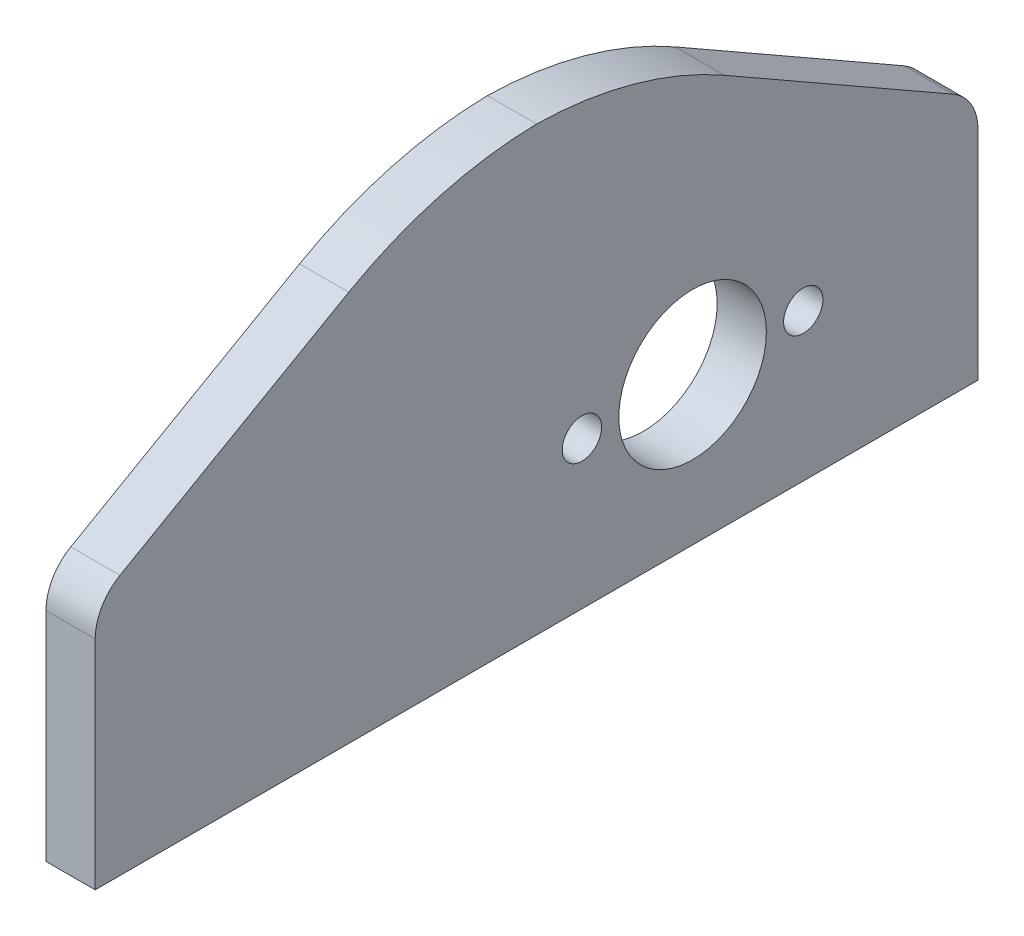
ISO-10303-21;
HEADER;
FILE_DESCRIPTION(('STEP AP214'),'2;1');
FILE_NAME('part.step','',(''),(''),'','','');
FILE_SCHEMA(('AUTOMOTIVE_DESIGN { 1 0 10303 214 1 1 1 1 }'));
ENDSEC;
DATA;
#1=APPLICATION_CONTEXT('core data for automotive mechanical design processes');
#2=APPLICATION_PROTOCOL_DEFINITION('international standard','automotive_design',2000,#1);
#3=PRODUCT_CONTEXT('',#1,'mechanical');
#4=PRODUCT('Part','Part','',(#3));
#5=PRODUCT_RELATED_PRODUCT_CATEGORY('part','',(#4));
#6=PRODUCT_DEFINITION_FORMATION('','',#4);
#7=PRODUCT_DEFINITION_CONTEXT('part definition',#1,'design');
#8=PRODUCT_DEFINITION('design','',#6,#7);
#9=PRODUCT_DEFINITION_SHAPE('','',#8);
#10=(LENGTH_UNIT() NAMED_UNIT(*) SI_UNIT(.MILLI.,.METRE.));
#11=(NAMED_UNIT(*) PLANE_ANGLE_UNIT() SI_UNIT($,.RADIAN.));
#12=(NAMED_UNIT(*) SI_UNIT($,.STERADIAN.) SOLID_ANGLE_UNIT());
#13=UNCERTAINTY_MEASURE_WITH_UNIT(LENGTH_MEASURE(1.E-05),#10,'distance_accuracy_value','');
#14=(GEOMETRIC_REPRESENTATION_CONTEXT(3) GLOBAL_UNCERTAINTY_ASSIGNED_CONTEXT((#13)) GLOBAL_UNIT_ASSIGNED_CONTEXT((#10,
#11,#12)) REPRESENTATION_CONTEXT('',''));
#15=CARTESIAN_POINT('',(0.,0.,0.));
#16=DIRECTION('',(0.,0.,1.));
#17=DIRECTION('',(1.,0.,0.));
#18=AXIS2_PLACEMENT_3D('',#15,#16,#17);
#19=CARTESIAN_POINT('',(2.,0.,-17.95));
#20=DIRECTION('',(0.,0.,1.));
#21=DIRECTION('',(1.,0.,0.));
#22=AXIS2_PLACEMENT_3D('',#19,#20,#21);
#23=PLANE('',#22);
#24=DIRECTION('',(0.,1.,0.));
#25=VECTOR('',#24,1.);
#26=CARTESIAN_POINT('',(0.,0.,-17.95));
#27=LINE('',#26,#25);
#28=CARTESIAN_POINT('',(0.,-10.,-17.95));
#29=VERTEX_POINT('',#28);
#30=CARTESIAN_POINT('',(0.,-1.16064507094244,-17.95));
#31=VERTEX_POINT('',#30);
#32=EDGE_CURVE('E141',#29,#31,#27,.T.);
#33=ORIENTED_EDGE('',*,*,#32,.T.);
#34=DIRECTION('',(-1.,0.,0.));
#35=VECTOR('',#34,1.);
#36=CARTESIAN_POINT('',(2.,-1.16064507094244,-17.95));
#37=LINE('',#36,#35);
#38=CARTESIAN_POINT('',(2.,-1.16064507094244,-17.95));
#39=VERTEX_POINT('',#38);
#40=EDGE_CURVE('E169',#31,#39,#37,.F.);
#41=ORIENTED_EDGE('',*,*,#40,.T.);
#42=DIRECTION('',(0.,1.,0.));
#43=VECTOR('',#42,1.);
#44=CARTESIAN_POINT('',(2.,0.,-17.95));
#45=LINE('',#44,#43);
#46=CARTESIAN_POINT('',(2.,-10.,-17.95));
#47=VERTEX_POINT('',#46);
#48=EDGE_CURVE('E157',#47,#39,#45,.T.);
#49=ORIENTED_EDGE('',*,*,#48,.F.);
#50=DIRECTION('',(-1.,0.,0.));
#51=VECTOR('',#50,1.);
#52=CARTESIAN_POINT('',(2.,-10.,-17.95));
#53=LINE('',#52,#51);
#54=EDGE_CURVE('E130',#47,#29,#53,.T.);
#55=ORIENTED_EDGE('',*,*,#54,.T.);
#56=EDGE_LOOP('',(#33,#41,#49,#55));
#57=FACE_BOUND('',#56,.T.);
#58=ADVANCED_FACE('F39',(#57),#23,.F.);
#59=CARTESIAN_POINT('',(2.,8.,-3.95000000000001));
#60=DIRECTION('',(0.,-0.868243142124459,0.496138938356834));
#61=DIRECTION('',(0.,-0.496138938356834,-0.868243142124459));
#62=AXIS2_PLACEMENT_3D('',#59,#60,#61);
#63=PLANE('',#62);
#64=DIRECTION('',(0.,0.496138938356834,0.868243142124459));
#65=VECTOR('',#64,1.);
#66=CARTESIAN_POINT('',(0.,8.,-3.95000000000001));
#67=LINE('',#66,#65);
#68=CARTESIAN_POINT('',(0.,0.575841213306475,-16.9422778767137));
#69=VERTEX_POINT('',#68);
#70=CARTESIAN_POINT('',(0.,5.89189027399135,-7.63919202051514));
#71=VERTEX_POINT('',#70);
#72=EDGE_CURVE('E145',#69,#71,#67,.T.);
#73=ORIENTED_EDGE('',*,*,#72,.T.);
#74=DIRECTION('',(-1.,0.,0.));
#75=VECTOR('',#74,1.);
#76=CARTESIAN_POINT('',(2.,5.89189027399135,-7.63919202051514));
#77=LINE('',#76,#75);
#78=CARTESIAN_POINT('',(2.,5.89189027399135,-7.63919202051514));
#79=VERTEX_POINT('',#78);
#80=EDGE_CURVE('E190',#71,#79,#77,.F.);
#81=ORIENTED_EDGE('',*,*,#80,.T.);
#82=DIRECTION('',(0.,0.496138938356834,0.868243142124459));
#83=VECTOR('',#82,1.);
#84=CARTESIAN_POINT('',(2.,8.,-3.95000000000001));
#85=LINE('',#84,#83);
#86=CARTESIAN_POINT('',(2.,0.575841213306475,-16.9422778767137));
#87=VERTEX_POINT('',#86);
#88=EDGE_CURVE('E201',#87,#79,#85,.T.);
#89=ORIENTED_EDGE('',*,*,#88,.F.);
#90=DIRECTION('',(-1.,0.,0.));
#91=VECTOR('',#90,1.);
#92=CARTESIAN_POINT('',(2.,0.575841213306475,-16.9422778767137));
#93=LINE('',#92,#91);
#94=EDGE_CURVE('E129',#87,#69,#93,.T.);
#95=ORIENTED_EDGE('',*,*,#94,.T.);
#96=EDGE_LOOP('',(#73,#81,#89,#95));
#97=FACE_BOUND('',#96,.T.);
#98=ADVANCED_FACE('F200',(#97),#63,.F.);
#99=CARTESIAN_POINT('',(2.,0.,17.95));
#100=DIRECTION('',(0.,-0.868243142124459,-0.496138938356834));
#101=DIRECTION('',(0.,0.496138938356834,-0.868243142124459));
#102=AXIS2_PLACEMENT_3D('',#99,#100,#101);
#103=PLANE('',#102);
#104=DIRECTION('',(0.,-0.496138938356834,0.868243142124459));
#105=VECTOR('',#104,1.);
#106=CARTESIAN_POINT('',(2.,0.,17.95));
#107=LINE('',#106,#105);
#108=CARTESIAN_POINT('',(2.,5.89189027399134,7.63919202051515));
#109=VERTEX_POINT('',#108);
#110=CARTESIAN_POINT('',(2.,0.575841213306475,16.9422778767137));
#111=VERTEX_POINT('',#110);
#112=EDGE_CURVE('E119',#109,#111,#107,.T.);
#113=ORIENTED_EDGE('',*,*,#112,.F.);
#114=DIRECTION('',(-1.,0.,0.));
#115=VECTOR('',#114,1.);
#116=CARTESIAN_POINT('',(2.,5.89189027399134,7.63919202051515));
#117=LINE('',#116,#115);
#118=CARTESIAN_POINT('',(0.,5.89189027399134,7.63919202051515));
#119=VERTEX_POINT('',#118);
#120=EDGE_CURVE('E11',#109,#119,#117,.T.);
#121=ORIENTED_EDGE('',*,*,#120,.T.);
#122=DIRECTION('',(0.,-0.496138938356834,0.868243142124459));
#123=VECTOR('',#122,1.);
#124=CARTESIAN_POINT('',(0.,0.,17.95));
#125=LINE('',#124,#123);
#126=CARTESIAN_POINT('',(0.,0.575841213306475,16.9422778767137));
#127=VERTEX_POINT('',#126);
#128=EDGE_CURVE('E150',#119,#127,#125,.T.);
#129=ORIENTED_EDGE('',*,*,#128,.T.);
#130=DIRECTION('',(-1.,0.,0.));
#131=VECTOR('',#130,1.);
#132=CARTESIAN_POINT('',(2.,0.575841213306475,16.9422778767137));
#133=LINE('',#132,#131);
#134=EDGE_CURVE('E180',#127,#111,#133,.F.);
#135=ORIENTED_EDGE('',*,*,#134,.T.);
#136=EDGE_LOOP('',(#113,#121,#129,#135));
#137=FACE_BOUND('',#136,.T.);
#138=ADVANCED_FACE('F270',(#137),#103,.F.);
#139=CARTESIAN_POINT('',(2.,0.,17.95));
#140=DIRECTION('',(0.,0.,-1.));
#141=DIRECTION('',(-1.,0.,0.));
#142=AXIS2_PLACEMENT_3D('',#139,#140,#141);
#143=PLANE('',#142);
#144=DIRECTION('',(0.,-1.,0.));
#145=VECTOR('',#144,1.);
#146=CARTESIAN_POINT('',(2.,0.,17.95));
#147=LINE('',#146,#145);
#148=CARTESIAN_POINT('',(2.,-1.16064507094244,17.95));
#149=VERTEX_POINT('',#148);
#150=CARTESIAN_POINT('',(2.,-10.,17.95));
#151=VERTEX_POINT('',#150);
#152=EDGE_CURVE('E106',#149,#151,#147,.T.);
#153=ORIENTED_EDGE('',*,*,#152,.F.);
#154=DIRECTION('',(-1.,0.,0.));
#155=VECTOR('',#154,1.);
#156=CARTESIAN_POINT('',(2.,-1.16064507094244,17.95));
#157=LINE('',#156,#155);
#158=CARTESIAN_POINT('',(0.,-1.16064507094244,17.95));
#159=VERTEX_POINT('',#158);
#160=EDGE_CURVE('E177',#149,#159,#157,.T.);
#161=ORIENTED_EDGE('',*,*,#160,.T.);
#162=DIRECTION('',(0.,-1.,0.));
#163=VECTOR('',#162,1.);
#164=CARTESIAN_POINT('',(0.,0.,17.95));
#165=LINE('',#164,#163);
#166=CARTESIAN_POINT('',(0.,-10.,17.95));
#167=VERTEX_POINT('',#166);
#168=EDGE_CURVE('E125',#159,#167,#165,.T.);
#169=ORIENTED_EDGE('',*,*,#168,.T.);
#170=DIRECTION('',(-1.,0.,0.));
#171=VECTOR('',#170,1.);
#172=CARTESIAN_POINT('',(2.,-10.,17.95));
#173=LINE('',#172,#171);
#174=EDGE_CURVE('E122',#151,#167,#173,.T.);
#175=ORIENTED_EDGE('',*,*,#174,.F.);
#176=EDGE_LOOP('',(#153,#161,#169,#175));
#177=FACE_BOUND('',#176,.T.);
#178=ADVANCED_FACE('F123',(#177),#143,.F.);
#179=CARTESIAN_POINT('',(2.,-10.,17.95));
#180=DIRECTION('',(0.,1.,0.));
#181=DIRECTION('',(0.,0.,1.));
#182=AXIS2_PLACEMENT_3D('',#179,#180,#181);
#183=PLANE('',#182);
#184=DIRECTION('',(0.,0.,-1.));
#185=VECTOR('',#184,1.);
#186=CARTESIAN_POINT('',(0.,-10.,17.95));
#187=LINE('',#186,#185);
#188=EDGE_CURVE('E155',#167,#29,#187,.T.);
#189=ORIENTED_EDGE('',*,*,#188,.T.);
#190=ORIENTED_EDGE('',*,*,#54,.F.);
#191=DIRECTION('',(0.,0.,-1.));
#192=VECTOR('',#191,1.);
#193=CARTESIAN_POINT('',(2.,-10.,17.95));
#194=LINE('',#193,#192);
#195=EDGE_CURVE('E111',#151,#47,#194,.T.);
#196=ORIENTED_EDGE('',*,*,#195,.F.);
#197=ORIENTED_EDGE('',*,*,#174,.T.);
#198=EDGE_LOOP('',(#189,#190,#196,#197));
#199=FACE_BOUND('',#198,.T.);
#200=ADVANCED_FACE('F132',(#199),#183,.F.);
#201=CARTESIAN_POINT('',(2.,0.,0.));
#202=DIRECTION('',(1.,0.,0.));
#203=DIRECTION('',(0.,0.,-1.));
#204=AXIS2_PLACEMENT_3D('',#201,#202,#203);
#205=PLANE('',#204);
#206=CARTESIAN_POINT('',(2.,-4.,-10.8442887702248));
#207=DIRECTION('',(1.,0.,0.));
#208=DIRECTION('',(0.,0.,-1.));
#209=AXIS2_PLACEMENT_3D('',#206,#207,#208);
#210=CIRCLE('',#209,0.800000000000001);
#211=CARTESIAN_POINT('',(2.,-4.,-11.6442887702248));
#212=VERTEX_POINT('',#211);
#213=EDGE_CURVE('E221',#212,#212,#210,.T.);
#214=ORIENTED_EDGE('',*,*,#213,.F.);
#215=EDGE_LOOP('',(#214));
#216=FACE_BOUND('',#215,.T.);
#217=CARTESIAN_POINT('',(2.,-4.,-1.84428877022476));
#218=DIRECTION('',(1.,0.,0.));
#219=DIRECTION('',(0.,0.,-1.));
#220=AXIS2_PLACEMENT_3D('',#217,#218,#219);
#221=CIRCLE('',#220,0.8);
#222=CARTESIAN_POINT('',(2.,-4.,-2.64428877022476));
#223=VERTEX_POINT('',#222);
#224=EDGE_CURVE('E229',#223,#223,#221,.T.);
#225=ORIENTED_EDGE('',*,*,#224,.F.);
#226=EDGE_LOOP('',(#225));
#227=FACE_BOUND('',#226,.T.);
#228=CARTESIAN_POINT('',(2.,-4.,-6.34428877022476));
#229=DIRECTION('',(1.,0.,0.));
#230=DIRECTION('',(0.,0.,-1.));
#231=AXIS2_PLACEMENT_3D('',#228,#229,#230);
#232=CIRCLE('',#231,3.);
#233=CARTESIAN_POINT('',(2.,-4.,-9.34428877022476));
#234=VERTEX_POINT('',#233);
#235=EDGE_CURVE('E213',#234,#234,#232,.T.);
#236=ORIENTED_EDGE('',*,*,#235,.F.);
#237=EDGE_LOOP('',(#236));
#238=FACE_BOUND('',#237,.T.);
#239=ORIENTED_EDGE('',*,*,#88,.T.);
#240=CARTESIAN_POINT('',(2.,-8.,0.299030993194197));
#241=DIRECTION('',(1.,0.,0.));
#242=DIRECTION('',(0.,0.,-1.));
#243=AXIS2_PLACEMENT_3D('',#240,#241,#242);
#244=CIRCLE('',#243,16.);
#245=CARTESIAN_POINT('',(2.,7.99720539547796,0.));
#246=VERTEX_POINT('',#245);
#247=EDGE_CURVE('E49',#79,#246,#244,.T.);
#248=ORIENTED_EDGE('',*,*,#247,.T.);
#249=CARTESIAN_POINT('',(2.,-8.,-0.299030993194194));
#250=DIRECTION('',(1.,0.,0.));
#251=DIRECTION('',(0.,0.,-1.));
#252=AXIS2_PLACEMENT_3D('',#249,#250,#251);
#253=CIRCLE('',#252,16.);
#254=EDGE_CURVE('E59',#246,#109,#253,.T.);
#255=ORIENTED_EDGE('',*,*,#254,.T.);
#256=ORIENTED_EDGE('',*,*,#112,.T.);
#257=CARTESIAN_POINT('',(2.,-1.16064507094244,15.95));
#258=DIRECTION('',(1.,0.,0.));
#259=DIRECTION('',(0.,0.,-1.));
#260=AXIS2_PLACEMENT_3D('',#257,#258,#259);
#261=CIRCLE('',#260,2.);
#262=EDGE_CURVE('E114',#111,#149,#261,.T.);
#263=ORIENTED_EDGE('',*,*,#262,.T.);
#264=ORIENTED_EDGE('',*,*,#152,.T.);
#265=ORIENTED_EDGE('',*,*,#195,.T.);
#266=ORIENTED_EDGE('',*,*,#48,.T.);
#267=CARTESIAN_POINT('',(2.,-1.16064507094244,-15.95));
#268=DIRECTION('',(1.,0.,0.));
#269=DIRECTION('',(0.,0.,-1.));
#270=AXIS2_PLACEMENT_3D('',#267,#268,#269);
#271=CIRCLE('',#270,2.);
#272=EDGE_CURVE('E174',#39,#87,#271,.T.);
#273=ORIENTED_EDGE('',*,*,#272,.T.);
#274=EDGE_LOOP('',(#239,#248,#255,#256,#263,#264,#265,#266,#273));
#275=FACE_BOUND('',#274,.T.);
#276=ADVANCED_FACE('F108',(#216,#227,#238,#275),#205,.T.);
#277=CARTESIAN_POINT('',(0.,0.,0.));
#278=DIRECTION('',(1.,0.,0.));
#279=DIRECTION('',(0.,0.,-1.));
#280=AXIS2_PLACEMENT_3D('',#277,#278,#279);
#281=PLANE('',#280);
#282=CARTESIAN_POINT('',(0.,-4.,-10.8442887702248));
#283=DIRECTION('',(1.,0.,0.));
#284=DIRECTION('',(0.,0.,-1.));
#285=AXIS2_PLACEMENT_3D('',#282,#283,#284);
#286=CIRCLE('',#285,0.800000000000001);
#287=CARTESIAN_POINT('',(0.,-4.,-11.6442887702248));
#288=VERTEX_POINT('',#287);
#289=EDGE_CURVE('E225',#288,#288,#286,.T.);
#290=ORIENTED_EDGE('',*,*,#289,.T.);
#291=EDGE_LOOP('',(#290));
#292=FACE_BOUND('',#291,.T.);
#293=CARTESIAN_POINT('',(0.,-4.,-1.84428877022476));
#294=DIRECTION('',(1.,0.,0.));
#295=DIRECTION('',(0.,0.,-1.));
#296=AXIS2_PLACEMENT_3D('',#293,#294,#295);
#297=CIRCLE('',#296,0.8);
#298=CARTESIAN_POINT('',(0.,-4.,-2.64428877022476));
#299=VERTEX_POINT('',#298);
#300=EDGE_CURVE('E217',#299,#299,#297,.T.);
#301=ORIENTED_EDGE('',*,*,#300,.T.);
#302=EDGE_LOOP('',(#301));
#303=FACE_BOUND('',#302,.T.);
#304=CARTESIAN_POINT('',(0.,-4.,-6.34428877022476));
#305=DIRECTION('',(1.,0.,0.));
#306=DIRECTION('',(0.,0.,-1.));
#307=AXIS2_PLACEMENT_3D('',#304,#305,#306);
#308=CIRCLE('',#307,3.);
#309=CARTESIAN_POINT('',(0.,-4.,-9.34428877022476));
#310=VERTEX_POINT('',#309);
#311=EDGE_CURVE('E146',#310,#310,#308,.T.);
#312=ORIENTED_EDGE('',*,*,#311,.T.);
#313=EDGE_LOOP('',(#312));
#314=FACE_BOUND('',#313,.T.);
#315=CARTESIAN_POINT('',(0.,-8.,-0.299030993194194));
#316=DIRECTION('',(1.,0.,0.));
#317=DIRECTION('',(0.,0.,-1.));
#318=AXIS2_PLACEMENT_3D('',#315,#316,#317);
#319=CIRCLE('',#318,16.);
#320=CARTESIAN_POINT('',(0.,7.99720539547796,0.));
#321=VERTEX_POINT('',#320);
#322=EDGE_CURVE('E184',#119,#321,#319,.F.);
#323=ORIENTED_EDGE('',*,*,#322,.T.);
#324=CARTESIAN_POINT('',(0.,-8.,0.299030993194197));
#325=DIRECTION('',(1.,0.,0.));
#326=DIRECTION('',(0.,0.,-1.));
#327=AXIS2_PLACEMENT_3D('',#324,#325,#326);
#328=CIRCLE('',#327,16.);
#329=EDGE_CURVE('E187',#321,#71,#328,.F.);
#330=ORIENTED_EDGE('',*,*,#329,.T.);
#331=ORIENTED_EDGE('',*,*,#72,.F.);
#332=CARTESIAN_POINT('',(0.,-1.16064507094244,-15.95));
#333=DIRECTION('',(1.,0.,0.));
#334=DIRECTION('',(0.,0.,-1.));
#335=AXIS2_PLACEMENT_3D('',#332,#333,#334);
#336=CIRCLE('',#335,2.);
#337=EDGE_CURVE('E166',#69,#31,#336,.F.);
#338=ORIENTED_EDGE('',*,*,#337,.T.);
#339=ORIENTED_EDGE('',*,*,#32,.F.);
#340=ORIENTED_EDGE('',*,*,#188,.F.);
#341=ORIENTED_EDGE('',*,*,#168,.F.);
#342=CARTESIAN_POINT('',(0.,-1.16064507094244,15.95));
#343=DIRECTION('',(1.,0.,0.));
#344=DIRECTION('',(0.,0.,-1.));
#345=AXIS2_PLACEMENT_3D('',#342,#343,#344);
#346=CIRCLE('',#345,2.);
#347=EDGE_CURVE('E162',#159,#127,#346,.F.);
#348=ORIENTED_EDGE('',*,*,#347,.T.);
#349=ORIENTED_EDGE('',*,*,#128,.F.);
#350=EDGE_LOOP('',(#323,#330,#331,#338,#339,#340,#341,#348,#349));
#351=FACE_BOUND('',#350,.T.);
#352=ADVANCED_FACE('F237',(#292,#303,#314,#351),#281,.F.);
#353=CARTESIAN_POINT('',(0.,-4.,-6.34428877022476));
#354=DIRECTION('',(1.,0.,0.));
#355=DIRECTION('',(0.,0.,-1.));
#356=AXIS2_PLACEMENT_3D('',#353,#354,#355);
#357=CYLINDRICAL_SURFACE('',#356,3.);
#358=ORIENTED_EDGE('',*,*,#311,.F.);
#359=EDGE_LOOP('',(#358));
#360=FACE_BOUND('',#359,.T.);
#361=ORIENTED_EDGE('',*,*,#235,.T.);
#362=EDGE_LOOP('',(#361));
#363=FACE_BOUND('',#362,.T.);
#364=ADVANCED_FACE('F244',(#360,#363),#357,.F.);
#365=CARTESIAN_POINT('',(0.,-4.,-1.84428877022476));
#366=DIRECTION('',(1.,0.,0.));
#367=DIRECTION('',(0.,0.,-1.));
#368=AXIS2_PLACEMENT_3D('',#365,#366,#367);
#369=CYLINDRICAL_SURFACE('',#368,0.8);
#370=ORIENTED_EDGE('',*,*,#300,.F.);
#371=EDGE_LOOP('',(#370));
#372=FACE_BOUND('',#371,.T.);
#373=ORIENTED_EDGE('',*,*,#224,.T.);
#374=EDGE_LOOP('',(#373));
#375=FACE_BOUND('',#374,.T.);
#376=ADVANCED_FACE('F240',(#372,#375),#369,.F.);
#377=CARTESIAN_POINT('',(0.,-4.,-10.8442887702248));
#378=DIRECTION('',(1.,0.,0.));
#379=DIRECTION('',(0.,0.,-1.));
#380=AXIS2_PLACEMENT_3D('',#377,#378,#379);
#381=CYLINDRICAL_SURFACE('',#380,0.800000000000001);
#382=ORIENTED_EDGE('',*,*,#289,.F.);
#383=EDGE_LOOP('',(#382));
#384=FACE_BOUND('',#383,.T.);
#385=ORIENTED_EDGE('',*,*,#213,.T.);
#386=EDGE_LOOP('',(#385));
#387=FACE_BOUND('',#386,.T.);
#388=ADVANCED_FACE('F243',(#384,#387),#381,.F.);
#389=CARTESIAN_POINT('',(2.,-1.16064507094244,-15.95));
#390=DIRECTION('',(-1.,0.,0.));
#391=DIRECTION('',(0.,0.,1.));
#392=AXIS2_PLACEMENT_3D('',#389,#390,#391);
#393=CYLINDRICAL_SURFACE('',#392,2.);
#394=ORIENTED_EDGE('',*,*,#272,.F.);
#395=ORIENTED_EDGE('',*,*,#40,.F.);
#396=ORIENTED_EDGE('',*,*,#337,.F.);
#397=ORIENTED_EDGE('',*,*,#94,.F.);
#398=EDGE_LOOP('',(#394,#395,#396,#397));
#399=FACE_BOUND('',#398,.T.);
#400=ADVANCED_FACE('F274',(#399),#393,.T.);
#401=CARTESIAN_POINT('',(2.,-1.16064507094244,15.95));
#402=DIRECTION('',(-1.,0.,0.));
#403=DIRECTION('',(0.,0.,1.));
#404=AXIS2_PLACEMENT_3D('',#401,#402,#403);
#405=CYLINDRICAL_SURFACE('',#404,2.);
#406=ORIENTED_EDGE('',*,*,#262,.F.);
#407=ORIENTED_EDGE('',*,*,#134,.F.);
#408=ORIENTED_EDGE('',*,*,#347,.F.);
#409=ORIENTED_EDGE('',*,*,#160,.F.);
#410=EDGE_LOOP('',(#406,#407,#408,#409));
#411=FACE_BOUND('',#410,.T.);
#412=ADVANCED_FACE('F277',(#411),#405,.T.);
#413=CARTESIAN_POINT('',(2.,-8.,-0.299030993194194));
#414=DIRECTION('',(-1.,0.,0.));
#415=DIRECTION('',(0.,0.,1.));
#416=AXIS2_PLACEMENT_3D('',#413,#414,#415);
#417=CYLINDRICAL_SURFACE('',#416,16.);
#418=ORIENTED_EDGE('',*,*,#120,.F.);
#419=ORIENTED_EDGE('',*,*,#254,.F.);
#420=DIRECTION('',(-1.,0.,0.));
#421=VECTOR('',#420,1.);
#422=CARTESIAN_POINT('',(1.,7.99720539547796,0.));
#423=LINE('',#422,#421);
#424=EDGE_CURVE('E43',#321,#246,#423,.F.);
#425=ORIENTED_EDGE('',*,*,#424,.F.);
#426=ORIENTED_EDGE('',*,*,#322,.F.);
#427=EDGE_LOOP('',(#418,#419,#425,#426));
#428=FACE_BOUND('',#427,.T.);
#429=ADVANCED_FACE('F41',(#428),#417,.T.);
#430=CARTESIAN_POINT('',(2.,-8.,0.299030993194197));
#431=DIRECTION('',(-1.,0.,0.));
#432=DIRECTION('',(0.,0.,1.));
#433=AXIS2_PLACEMENT_3D('',#430,#431,#432);
#434=CYLINDRICAL_SURFACE('',#433,16.);
#435=ORIENTED_EDGE('',*,*,#247,.F.);
#436=ORIENTED_EDGE('',*,*,#80,.F.);
#437=ORIENTED_EDGE('',*,*,#329,.F.);
#438=ORIENTED_EDGE('',*,*,#424,.T.);
#439=EDGE_LOOP('',(#435,#436,#437,#438));
#440=FACE_BOUND('',#439,.T.);
#441=ADVANCED_FACE('F281',(#440),#434,.T.);
#442=CLOSED_SHELL('',(#58,#98,#138,#178,#200,#276,#352,#364,#376,#388,#400,#412,#429,#441));
#443=MANIFOLD_SOLID_BREP('B2',#442);
#444=ADVANCED_BREP_SHAPE_REPRESENTATION('',(#18,#443),#14);
#445=SHAPE_DEFINITION_REPRESENTATION(#9,#444);
ENDSEC;
END-ISO-10303-21;
